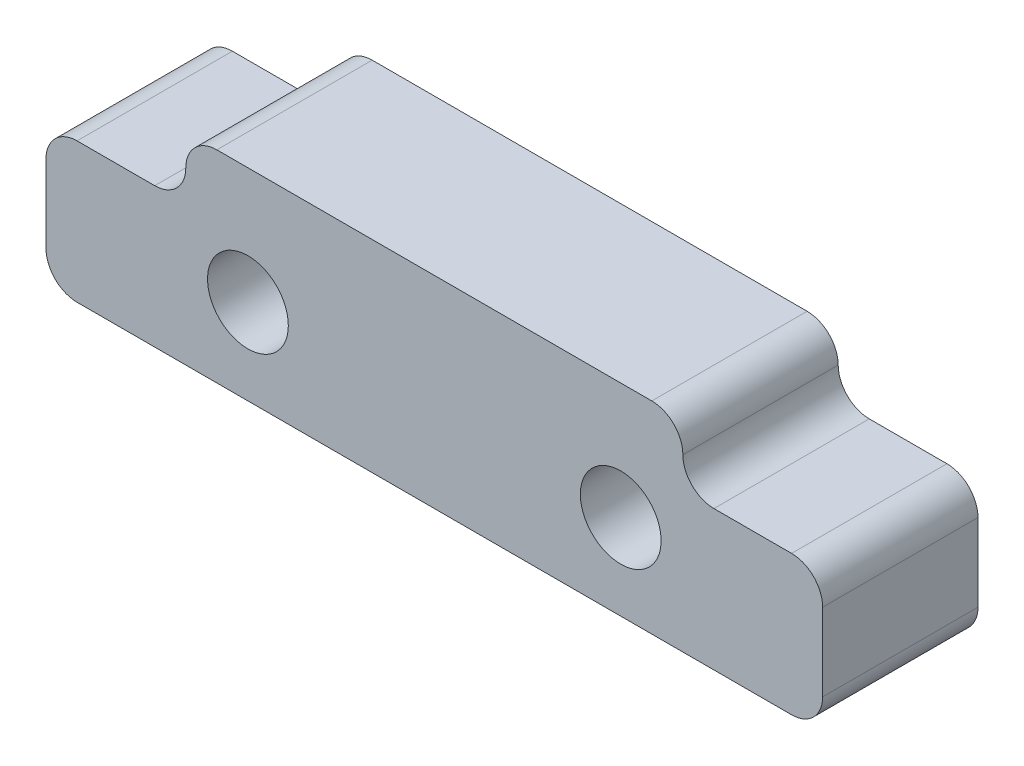
ISO-10303-21;
HEADER;
FILE_DESCRIPTION(('STEP AP214'),'2;1');
FILE_NAME('part.step','',(''),(''),'','','');
FILE_SCHEMA(('AUTOMOTIVE_DESIGN { 1 0 10303 214 1 1 1 1 }'));
ENDSEC;
DATA;
#1=APPLICATION_CONTEXT('core data for automotive mechanical design processes');
#2=APPLICATION_PROTOCOL_DEFINITION('international standard','automotive_design',2000,#1);
#3=PRODUCT_CONTEXT('',#1,'mechanical');
#4=PRODUCT('Part','Part','',(#3));
#5=PRODUCT_RELATED_PRODUCT_CATEGORY('part','',(#4));
#6=PRODUCT_DEFINITION_FORMATION('','',#4);
#7=PRODUCT_DEFINITION_CONTEXT('part definition',#1,'design');
#8=PRODUCT_DEFINITION('design','',#6,#7);
#9=PRODUCT_DEFINITION_SHAPE('','',#8);
#10=(LENGTH_UNIT() NAMED_UNIT(*) SI_UNIT(.MILLI.,.METRE.));
#11=(NAMED_UNIT(*) PLANE_ANGLE_UNIT() SI_UNIT($,.RADIAN.));
#12=(NAMED_UNIT(*) SI_UNIT($,.STERADIAN.) SOLID_ANGLE_UNIT());
#13=UNCERTAINTY_MEASURE_WITH_UNIT(LENGTH_MEASURE(1.E-05),#10,'distance_accuracy_value','');
#14=(GEOMETRIC_REPRESENTATION_CONTEXT(3) GLOBAL_UNCERTAINTY_ASSIGNED_CONTEXT((#13)) GLOBAL_UNIT_ASSIGNED_CONTEXT((#10,
#11,#12)) REPRESENTATION_CONTEXT('',''));
#15=CARTESIAN_POINT('',(0.,0.,0.));
#16=DIRECTION('',(0.,0.,1.));
#17=DIRECTION('',(1.,0.,0.));
#18=AXIS2_PLACEMENT_3D('',#15,#16,#17);
#19=CARTESIAN_POINT('',(0.,0.,5.));
#20=DIRECTION('',(0.,0.,-1.));
#21=DIRECTION('',(-1.,0.,0.));
#22=AXIS2_PLACEMENT_3D('',#19,#20,#21);
#23=PLANE('',#22);
#24=DIRECTION('',(1.,0.,0.));
#25=VECTOR('',#24,1.);
#26=CARTESIAN_POINT('',(12.5,-2.25,5.));
#27=LINE('',#26,#25);
#28=CARTESIAN_POINT('',(-11.5,-2.25,5.));
#29=VERTEX_POINT('',#28);
#30=CARTESIAN_POINT('',(11.5,-2.25,5.));
#31=VERTEX_POINT('',#30);
#32=EDGE_CURVE('E252',#29,#31,#27,.T.);
#33=ORIENTED_EDGE('',*,*,#32,.T.);
#34=CARTESIAN_POINT('',(11.5,-1.25,5.));
#35=DIRECTION('',(0.,0.,-1.));
#36=DIRECTION('',(-1.,0.,0.));
#37=AXIS2_PLACEMENT_3D('',#34,#35,#36);
#38=CIRCLE('',#37,1.);
#39=CARTESIAN_POINT('',(12.5,-1.25,5.));
#40=VERTEX_POINT('',#39);
#41=EDGE_CURVE('E198',#31,#40,#38,.F.);
#42=ORIENTED_EDGE('',*,*,#41,.T.);
#43=DIRECTION('',(0.,1.,0.));
#44=VECTOR('',#43,1.);
#45=CARTESIAN_POINT('',(12.5,-2.25,5.));
#46=LINE('',#45,#44);
#47=CARTESIAN_POINT('',(12.5,1.25,5.));
#48=VERTEX_POINT('',#47);
#49=EDGE_CURVE('E156',#40,#48,#46,.T.);
#50=ORIENTED_EDGE('',*,*,#49,.T.);
#51=CARTESIAN_POINT('',(11.5,1.25,5.));
#52=DIRECTION('',(0.,0.,-1.));
#53=DIRECTION('',(-1.,0.,0.));
#54=AXIS2_PLACEMENT_3D('',#51,#52,#53);
#55=CIRCLE('',#54,1.);
#56=CARTESIAN_POINT('',(11.5,2.25,5.));
#57=VERTEX_POINT('',#56);
#58=EDGE_CURVE('E196',#48,#57,#55,.F.);
#59=ORIENTED_EDGE('',*,*,#58,.T.);
#60=DIRECTION('',(-1.,0.,0.));
#61=VECTOR('',#60,1.);
#62=CARTESIAN_POINT('',(12.5,2.25,5.));
#63=LINE('',#62,#61);
#64=CARTESIAN_POINT('',(9.00000000000001,2.25,5.));
#65=VERTEX_POINT('',#64);
#66=EDGE_CURVE('E246',#57,#65,#63,.T.);
#67=ORIENTED_EDGE('',*,*,#66,.T.);
#68=CARTESIAN_POINT('',(9.00000000000001,3.25,5.));
#69=DIRECTION('',(0.,0.,-1.));
#70=DIRECTION('',(-1.,0.,0.));
#71=AXIS2_PLACEMENT_3D('',#68,#69,#70);
#72=CIRCLE('',#71,1.);
#73=CARTESIAN_POINT('',(8.,3.25,5.));
#74=VERTEX_POINT('',#73);
#75=EDGE_CURVE('E221',#65,#74,#72,.T.);
#76=ORIENTED_EDGE('',*,*,#75,.T.);
#77=CARTESIAN_POINT('',(7.,3.25,5.));
#78=DIRECTION('',(0.,0.,-1.));
#79=DIRECTION('',(-1.,0.,0.));
#80=AXIS2_PLACEMENT_3D('',#77,#78,#79);
#81=CIRCLE('',#80,1.);
#82=CARTESIAN_POINT('',(7.,4.25,5.));
#83=VERTEX_POINT('',#82);
#84=EDGE_CURVE('E189',#74,#83,#81,.F.);
#85=ORIENTED_EDGE('',*,*,#84,.T.);
#86=DIRECTION('',(-1.,0.,0.));
#87=VECTOR('',#86,1.);
#88=CARTESIAN_POINT('',(-8.,4.25,5.));
#89=LINE('',#88,#87);
#90=CARTESIAN_POINT('',(-7.,4.25,5.));
#91=VERTEX_POINT('',#90);
#92=EDGE_CURVE('E176',#83,#91,#89,.T.);
#93=ORIENTED_EDGE('',*,*,#92,.T.);
#94=CARTESIAN_POINT('',(-7.,3.25,5.));
#95=DIRECTION('',(0.,0.,-1.));
#96=DIRECTION('',(-1.,0.,0.));
#97=AXIS2_PLACEMENT_3D('',#94,#95,#96);
#98=CIRCLE('',#97,1.);
#99=CARTESIAN_POINT('',(-8.,3.25,5.));
#100=VERTEX_POINT('',#99);
#101=EDGE_CURVE('E50',#91,#100,#98,.F.);
#102=ORIENTED_EDGE('',*,*,#101,.T.);
#103=CARTESIAN_POINT('',(-9.,3.25,5.));
#104=DIRECTION('',(0.,0.,-1.));
#105=DIRECTION('',(-1.,0.,0.));
#106=AXIS2_PLACEMENT_3D('',#103,#104,#105);
#107=CIRCLE('',#106,1.);
#108=CARTESIAN_POINT('',(-9.,2.25,5.));
#109=VERTEX_POINT('',#108);
#110=EDGE_CURVE('E11',#100,#109,#107,.T.);
#111=ORIENTED_EDGE('',*,*,#110,.T.);
#112=DIRECTION('',(-1.,0.,0.));
#113=VECTOR('',#112,1.);
#114=CARTESIAN_POINT('',(-8.,2.25,5.));
#115=LINE('',#114,#113);
#116=CARTESIAN_POINT('',(-11.5,2.25,5.));
#117=VERTEX_POINT('',#116);
#118=EDGE_CURVE('E175',#109,#117,#115,.T.);
#119=ORIENTED_EDGE('',*,*,#118,.T.);
#120=CARTESIAN_POINT('',(-11.5,1.25,5.));
#121=DIRECTION('',(0.,0.,-1.));
#122=DIRECTION('',(-1.,0.,0.));
#123=AXIS2_PLACEMENT_3D('',#120,#121,#122);
#124=CIRCLE('',#123,1.);
#125=CARTESIAN_POINT('',(-12.5,1.25,5.));
#126=VERTEX_POINT('',#125);
#127=EDGE_CURVE('E192',#117,#126,#124,.F.);
#128=ORIENTED_EDGE('',*,*,#127,.T.);
#129=DIRECTION('',(0.,-1.,0.));
#130=VECTOR('',#129,1.);
#131=CARTESIAN_POINT('',(-12.5,-2.25,5.));
#132=LINE('',#131,#130);
#133=CARTESIAN_POINT('',(-12.5,-1.25,5.));
#134=VERTEX_POINT('',#133);
#135=EDGE_CURVE('E255',#126,#134,#132,.T.);
#136=ORIENTED_EDGE('',*,*,#135,.T.);
#137=CARTESIAN_POINT('',(-11.5,-1.25,5.));
#138=DIRECTION('',(0.,0.,-1.));
#139=DIRECTION('',(-1.,0.,0.));
#140=AXIS2_PLACEMENT_3D('',#137,#138,#139);
#141=CIRCLE('',#140,1.);
#142=EDGE_CURVE('E194',#134,#29,#141,.F.);
#143=ORIENTED_EDGE('',*,*,#142,.T.);
#144=EDGE_LOOP('',(#33,#42,#50,#59,#67,#76,#85,#93,#102,#111,#119,#128,#136,#143));
#145=FACE_BOUND('',#144,.T.);
#146=CARTESIAN_POINT('',(-6.,0.5,5.));
#147=DIRECTION('',(0.,0.,1.));
#148=DIRECTION('',(1.,0.,0.));
#149=AXIS2_PLACEMENT_3D('',#146,#147,#148);
#150=CIRCLE('',#149,1.3);
#151=CARTESIAN_POINT('',(-4.7,0.5,5.));
#152=VERTEX_POINT('',#151);
#153=EDGE_CURVE('E262',#152,#152,#150,.T.);
#154=ORIENTED_EDGE('',*,*,#153,.F.);
#155=EDGE_LOOP('',(#154));
#156=FACE_BOUND('',#155,.T.);
#157=CARTESIAN_POINT('',(6.,0.5,5.));
#158=DIRECTION('',(0.,0.,1.));
#159=DIRECTION('',(-1.,0.,0.));
#160=AXIS2_PLACEMENT_3D('',#157,#158,#159);
#161=CIRCLE('',#160,1.3);
#162=CARTESIAN_POINT('',(4.7,0.5,5.));
#163=VERTEX_POINT('',#162);
#164=EDGE_CURVE('E228',#163,#163,#161,.T.);
#165=ORIENTED_EDGE('',*,*,#164,.F.);
#166=EDGE_LOOP('',(#165));
#167=FACE_BOUND('',#166,.T.);
#168=ADVANCED_FACE('F34',(#145,#156,#167),#23,.F.);
#169=CARTESIAN_POINT('',(0.,0.,0.));
#170=DIRECTION('',(0.,0.,-1.));
#171=DIRECTION('',(-1.,0.,0.));
#172=AXIS2_PLACEMENT_3D('',#169,#170,#171);
#173=PLANE('',#172);
#174=CARTESIAN_POINT('',(-6.,0.5,0.));
#175=DIRECTION('',(0.,0.,1.));
#176=DIRECTION('',(1.,0.,0.));
#177=AXIS2_PLACEMENT_3D('',#174,#175,#176);
#178=CIRCLE('',#177,1.3);
#179=CARTESIAN_POINT('',(-4.7,0.5,0.));
#180=VERTEX_POINT('',#179);
#181=EDGE_CURVE('E443',#180,#180,#178,.T.);
#182=ORIENTED_EDGE('',*,*,#181,.T.);
#183=EDGE_LOOP('',(#182));
#184=FACE_BOUND('',#183,.T.);
#185=DIRECTION('',(0.,1.,0.));
#186=VECTOR('',#185,1.);
#187=CARTESIAN_POINT('',(12.5,-2.25,0.));
#188=LINE('',#187,#186);
#189=CARTESIAN_POINT('',(12.5,-1.25,0.));
#190=VERTEX_POINT('',#189);
#191=CARTESIAN_POINT('',(12.5,1.25,0.));
#192=VERTEX_POINT('',#191);
#193=EDGE_CURVE('E153',#190,#192,#188,.T.);
#194=ORIENTED_EDGE('',*,*,#193,.F.);
#195=CARTESIAN_POINT('',(11.5,-1.25,0.));
#196=DIRECTION('',(0.,0.,-1.));
#197=DIRECTION('',(-1.,0.,0.));
#198=AXIS2_PLACEMENT_3D('',#195,#196,#197);
#199=CIRCLE('',#198,1.);
#200=CARTESIAN_POINT('',(11.5,-2.25,0.));
#201=VERTEX_POINT('',#200);
#202=EDGE_CURVE('E136',#190,#201,#199,.T.);
#203=ORIENTED_EDGE('',*,*,#202,.T.);
#204=DIRECTION('',(1.,0.,0.));
#205=VECTOR('',#204,1.);
#206=CARTESIAN_POINT('',(12.5,-2.25,0.));
#207=LINE('',#206,#205);
#208=CARTESIAN_POINT('',(-11.5,-2.25,0.));
#209=VERTEX_POINT('',#208);
#210=EDGE_CURVE('E164',#209,#201,#207,.T.);
#211=ORIENTED_EDGE('',*,*,#210,.F.);
#212=CARTESIAN_POINT('',(-11.5,-1.25,0.));
#213=DIRECTION('',(0.,0.,-1.));
#214=DIRECTION('',(-1.,0.,0.));
#215=AXIS2_PLACEMENT_3D('',#212,#213,#214);
#216=CIRCLE('',#215,1.);
#217=CARTESIAN_POINT('',(-12.5,-1.25,0.));
#218=VERTEX_POINT('',#217);
#219=EDGE_CURVE('E183',#209,#218,#216,.T.);
#220=ORIENTED_EDGE('',*,*,#219,.T.);
#221=DIRECTION('',(0.,-1.,0.));
#222=VECTOR('',#221,1.);
#223=CARTESIAN_POINT('',(-12.5,-2.25,0.));
#224=LINE('',#223,#222);
#225=CARTESIAN_POINT('',(-12.5,1.25,0.));
#226=VERTEX_POINT('',#225);
#227=EDGE_CURVE('E169',#226,#218,#224,.T.);
#228=ORIENTED_EDGE('',*,*,#227,.F.);
#229=CARTESIAN_POINT('',(-11.5,1.25,0.));
#230=DIRECTION('',(0.,0.,-1.));
#231=DIRECTION('',(-1.,0.,0.));
#232=AXIS2_PLACEMENT_3D('',#229,#230,#231);
#233=CIRCLE('',#232,1.);
#234=CARTESIAN_POINT('',(-11.5,2.25,0.));
#235=VERTEX_POINT('',#234);
#236=EDGE_CURVE('E181',#226,#235,#233,.T.);
#237=ORIENTED_EDGE('',*,*,#236,.T.);
#238=DIRECTION('',(-1.,0.,0.));
#239=VECTOR('',#238,1.);
#240=CARTESIAN_POINT('',(-8.,2.25,0.));
#241=LINE('',#240,#239);
#242=CARTESIAN_POINT('',(-9.,2.25,0.));
#243=VERTEX_POINT('',#242);
#244=EDGE_CURVE('E260',#243,#235,#241,.T.);
#245=ORIENTED_EDGE('',*,*,#244,.F.);
#246=CARTESIAN_POINT('',(-9.,3.25,0.));
#247=DIRECTION('',(0.,0.,-1.));
#248=DIRECTION('',(-1.,0.,0.));
#249=AXIS2_PLACEMENT_3D('',#246,#247,#248);
#250=CIRCLE('',#249,1.);
#251=CARTESIAN_POINT('',(-8.,3.25,0.));
#252=VERTEX_POINT('',#251);
#253=EDGE_CURVE('E43',#243,#252,#250,.F.);
#254=ORIENTED_EDGE('',*,*,#253,.T.);
#255=CARTESIAN_POINT('',(-7.,3.25,0.));
#256=DIRECTION('',(0.,0.,-1.));
#257=DIRECTION('',(-1.,0.,0.));
#258=AXIS2_PLACEMENT_3D('',#255,#256,#257);
#259=CIRCLE('',#258,1.);
#260=CARTESIAN_POINT('',(-7.,4.25,0.));
#261=VERTEX_POINT('',#260);
#262=EDGE_CURVE('E179',#252,#261,#259,.T.);
#263=ORIENTED_EDGE('',*,*,#262,.T.);
#264=DIRECTION('',(-1.,0.,0.));
#265=VECTOR('',#264,1.);
#266=CARTESIAN_POINT('',(-8.,4.25,0.));
#267=LINE('',#266,#265);
#268=CARTESIAN_POINT('',(7.,4.25,0.));
#269=VERTEX_POINT('',#268);
#270=EDGE_CURVE('E167',#269,#261,#267,.T.);
#271=ORIENTED_EDGE('',*,*,#270,.F.);
#272=CARTESIAN_POINT('',(7.,3.25,0.));
#273=DIRECTION('',(0.,0.,-1.));
#274=DIRECTION('',(-1.,0.,0.));
#275=AXIS2_PLACEMENT_3D('',#272,#273,#274);
#276=CIRCLE('',#275,1.);
#277=CARTESIAN_POINT('',(8.,3.25,0.));
#278=VERTEX_POINT('',#277);
#279=EDGE_CURVE('E157',#269,#278,#276,.T.);
#280=ORIENTED_EDGE('',*,*,#279,.T.);
#281=CARTESIAN_POINT('',(9.00000000000001,3.25,0.));
#282=DIRECTION('',(0.,0.,-1.));
#283=DIRECTION('',(-1.,0.,0.));
#284=AXIS2_PLACEMENT_3D('',#281,#282,#283);
#285=CIRCLE('',#284,1.);
#286=CARTESIAN_POINT('',(9.00000000000001,2.25,0.));
#287=VERTEX_POINT('',#286);
#288=EDGE_CURVE('E219',#278,#287,#285,.F.);
#289=ORIENTED_EDGE('',*,*,#288,.T.);
#290=DIRECTION('',(-1.,0.,0.));
#291=VECTOR('',#290,1.);
#292=CARTESIAN_POINT('',(12.5,2.25,0.));
#293=LINE('',#292,#291);
#294=CARTESIAN_POINT('',(11.5,2.25,0.));
#295=VERTEX_POINT('',#294);
#296=EDGE_CURVE('E163',#295,#287,#293,.T.);
#297=ORIENTED_EDGE('',*,*,#296,.F.);
#298=CARTESIAN_POINT('',(11.5,1.25,0.));
#299=DIRECTION('',(0.,0.,-1.));
#300=DIRECTION('',(-1.,0.,0.));
#301=AXIS2_PLACEMENT_3D('',#298,#299,#300);
#302=CIRCLE('',#301,1.);
#303=EDGE_CURVE('E147',#295,#192,#302,.T.);
#304=ORIENTED_EDGE('',*,*,#303,.T.);
#305=EDGE_LOOP('',(#194,#203,#211,#220,#228,#237,#245,#254,#263,#271,#280,#289,#297,#304));
#306=FACE_BOUND('',#305,.T.);
#307=CARTESIAN_POINT('',(6.,0.5,0.));
#308=DIRECTION('',(0.,0.,1.));
#309=DIRECTION('',(-1.,0.,0.));
#310=AXIS2_PLACEMENT_3D('',#307,#308,#309);
#311=CIRCLE('',#310,1.3);
#312=CARTESIAN_POINT('',(4.7,0.5,0.));
#313=VERTEX_POINT('',#312);
#314=EDGE_CURVE('E224',#313,#313,#311,.T.);
#315=ORIENTED_EDGE('',*,*,#314,.T.);
#316=EDGE_LOOP('',(#315));
#317=FACE_BOUND('',#316,.T.);
#318=ADVANCED_FACE('F160',(#184,#306,#317),#173,.T.);
#319=CARTESIAN_POINT('',(-8.,2.25,5.));
#320=DIRECTION('',(0.,-1.,0.));
#321=DIRECTION('',(1.,0.,0.));
#322=AXIS2_PLACEMENT_3D('',#319,#320,#321);
#323=PLANE('',#322);
#324=ORIENTED_EDGE('',*,*,#244,.T.);
#325=DIRECTION('',(0.,0.,-1.));
#326=VECTOR('',#325,1.);
#327=CARTESIAN_POINT('',(-11.5,2.25,5.));
#328=LINE('',#327,#326);
#329=EDGE_CURVE('E212',#235,#117,#328,.F.);
#330=ORIENTED_EDGE('',*,*,#329,.T.);
#331=ORIENTED_EDGE('',*,*,#118,.F.);
#332=DIRECTION('',(0.,0.,-1.));
#333=VECTOR('',#332,1.);
#334=CARTESIAN_POINT('',(-9.,2.25,0.));
#335=LINE('',#334,#333);
#336=EDGE_CURVE('E210',#109,#243,#335,.T.);
#337=ORIENTED_EDGE('',*,*,#336,.T.);
#338=EDGE_LOOP('',(#324,#330,#331,#337));
#339=FACE_BOUND('',#338,.T.);
#340=ADVANCED_FACE('F285',(#339),#323,.F.);
#341=CARTESIAN_POINT('',(-12.5,-2.25,5.));
#342=DIRECTION('',(1.,0.,0.));
#343=DIRECTION('',(0.,0.,-1.));
#344=AXIS2_PLACEMENT_3D('',#341,#342,#343);
#345=PLANE('',#344);
#346=ORIENTED_EDGE('',*,*,#227,.T.);
#347=DIRECTION('',(0.,0.,-1.));
#348=VECTOR('',#347,1.);
#349=CARTESIAN_POINT('',(-12.5,-1.25,5.));
#350=LINE('',#349,#348);
#351=EDGE_CURVE('E208',#218,#134,#350,.F.);
#352=ORIENTED_EDGE('',*,*,#351,.T.);
#353=ORIENTED_EDGE('',*,*,#135,.F.);
#354=DIRECTION('',(0.,0.,-1.));
#355=VECTOR('',#354,1.);
#356=CARTESIAN_POINT('',(-12.5,1.25,5.));
#357=LINE('',#356,#355);
#358=EDGE_CURVE('E205',#126,#226,#357,.T.);
#359=ORIENTED_EDGE('',*,*,#358,.T.);
#360=EDGE_LOOP('',(#346,#352,#353,#359));
#361=FACE_BOUND('',#360,.T.);
#362=ADVANCED_FACE('F267',(#361),#345,.F.);
#363=CARTESIAN_POINT('',(12.5,-2.25,5.));
#364=DIRECTION('',(0.,1.,0.));
#365=DIRECTION('',(-1.,0.,0.));
#366=AXIS2_PLACEMENT_3D('',#363,#364,#365);
#367=PLANE('',#366);
#368=ORIENTED_EDGE('',*,*,#210,.T.);
#369=DIRECTION('',(0.,0.,-1.));
#370=VECTOR('',#369,1.);
#371=CARTESIAN_POINT('',(11.5,-2.25,5.));
#372=LINE('',#371,#370);
#373=EDGE_CURVE('E141',#201,#31,#372,.F.);
#374=ORIENTED_EDGE('',*,*,#373,.T.);
#375=ORIENTED_EDGE('',*,*,#32,.F.);
#376=DIRECTION('',(0.,0.,-1.));
#377=VECTOR('',#376,1.);
#378=CARTESIAN_POINT('',(-11.5,-2.25,5.));
#379=LINE('',#378,#377);
#380=EDGE_CURVE('E146',#29,#209,#379,.T.);
#381=ORIENTED_EDGE('',*,*,#380,.T.);
#382=EDGE_LOOP('',(#368,#374,#375,#381));
#383=FACE_BOUND('',#382,.T.);
#384=ADVANCED_FACE('F277',(#383),#367,.F.);
#385=CARTESIAN_POINT('',(12.5,-2.25,5.));
#386=DIRECTION('',(-1.,0.,0.));
#387=DIRECTION('',(0.,0.,1.));
#388=AXIS2_PLACEMENT_3D('',#385,#386,#387);
#389=PLANE('',#388);
#390=ORIENTED_EDGE('',*,*,#49,.F.);
#391=DIRECTION('',(0.,0.,-1.));
#392=VECTOR('',#391,1.);
#393=CARTESIAN_POINT('',(12.5,-1.25,5.));
#394=LINE('',#393,#392);
#395=EDGE_CURVE('E140',#40,#190,#394,.T.);
#396=ORIENTED_EDGE('',*,*,#395,.T.);
#397=ORIENTED_EDGE('',*,*,#193,.T.);
#398=DIRECTION('',(0.,0.,-1.));
#399=VECTOR('',#398,1.);
#400=CARTESIAN_POINT('',(12.5,1.25,5.));
#401=LINE('',#400,#399);
#402=EDGE_CURVE('E158',#192,#48,#401,.F.);
#403=ORIENTED_EDGE('',*,*,#402,.T.);
#404=EDGE_LOOP('',(#390,#396,#397,#403));
#405=FACE_BOUND('',#404,.T.);
#406=ADVANCED_FACE('F152',(#405),#389,.F.);
#407=CARTESIAN_POINT('',(12.5,2.25,5.));
#408=DIRECTION('',(0.,-1.,0.));
#409=DIRECTION('',(1.,0.,0.));
#410=AXIS2_PLACEMENT_3D('',#407,#408,#409);
#411=PLANE('',#410);
#412=ORIENTED_EDGE('',*,*,#66,.F.);
#413=DIRECTION('',(0.,0.,-1.));
#414=VECTOR('',#413,1.);
#415=CARTESIAN_POINT('',(11.5,2.25,5.));
#416=LINE('',#415,#414);
#417=EDGE_CURVE('E202',#57,#295,#416,.T.);
#418=ORIENTED_EDGE('',*,*,#417,.T.);
#419=ORIENTED_EDGE('',*,*,#296,.T.);
#420=DIRECTION('',(0.,0.,-1.));
#421=VECTOR('',#420,1.);
#422=CARTESIAN_POINT('',(9.00000000000001,2.25,5.));
#423=LINE('',#422,#421);
#424=EDGE_CURVE('E200',#287,#65,#423,.F.);
#425=ORIENTED_EDGE('',*,*,#424,.T.);
#426=EDGE_LOOP('',(#412,#418,#419,#425));
#427=FACE_BOUND('',#426,.T.);
#428=ADVANCED_FACE('F243',(#427),#411,.F.);
#429=CARTESIAN_POINT('',(-8.,4.25,5.));
#430=DIRECTION('',(0.,-1.,0.));
#431=DIRECTION('',(0.,0.,-1.));
#432=AXIS2_PLACEMENT_3D('',#429,#430,#431);
#433=PLANE('',#432);
#434=ORIENTED_EDGE('',*,*,#270,.T.);
#435=DIRECTION('',(0.,0.,-1.));
#436=VECTOR('',#435,1.);
#437=CARTESIAN_POINT('',(-7.,4.25,5.));
#438=LINE('',#437,#436);
#439=EDGE_CURVE('E217',#261,#91,#438,.F.);
#440=ORIENTED_EDGE('',*,*,#439,.T.);
#441=ORIENTED_EDGE('',*,*,#92,.F.);
#442=DIRECTION('',(0.,0.,-1.));
#443=VECTOR('',#442,1.);
#444=CARTESIAN_POINT('',(7.,4.25,5.));
#445=LINE('',#444,#443);
#446=EDGE_CURVE('E214',#83,#269,#445,.T.);
#447=ORIENTED_EDGE('',*,*,#446,.T.);
#448=EDGE_LOOP('',(#434,#440,#441,#447));
#449=FACE_BOUND('',#448,.T.);
#450=ADVANCED_FACE('F298',(#449),#433,.F.);
#451=CARTESIAN_POINT('',(-6.,0.5,5.));
#452=DIRECTION('',(0.,0.,-1.));
#453=DIRECTION('',(-1.,0.,0.));
#454=AXIS2_PLACEMENT_3D('',#451,#452,#453);
#455=CYLINDRICAL_SURFACE('',#454,1.3);
#456=ORIENTED_EDGE('',*,*,#153,.T.);
#457=EDGE_LOOP('',(#456));
#458=FACE_BOUND('',#457,.T.);
#459=ORIENTED_EDGE('',*,*,#181,.F.);
#460=EDGE_LOOP('',(#459));
#461=FACE_BOUND('',#460,.T.);
#462=ADVANCED_FACE('F295',(#458,#461),#455,.F.);
#463=CARTESIAN_POINT('',(6.,0.5,5.));
#464=DIRECTION('',(0.,0.,-1.));
#465=DIRECTION('',(-1.,0.,0.));
#466=AXIS2_PLACEMENT_3D('',#463,#464,#465);
#467=CYLINDRICAL_SURFACE('',#466,1.3);
#468=ORIENTED_EDGE('',*,*,#164,.T.);
#469=EDGE_LOOP('',(#468));
#470=FACE_BOUND('',#469,.T.);
#471=ORIENTED_EDGE('',*,*,#314,.F.);
#472=EDGE_LOOP('',(#471));
#473=FACE_BOUND('',#472,.T.);
#474=ADVANCED_FACE('F318',(#470,#473),#467,.F.);
#475=CARTESIAN_POINT('',(11.5,-1.25,5.));
#476=DIRECTION('',(0.,0.,-1.));
#477=DIRECTION('',(-1.,0.,0.));
#478=AXIS2_PLACEMENT_3D('',#475,#476,#477);
#479=CYLINDRICAL_SURFACE('',#478,1.);
#480=ORIENTED_EDGE('',*,*,#41,.F.);
#481=ORIENTED_EDGE('',*,*,#373,.F.);
#482=ORIENTED_EDGE('',*,*,#202,.F.);
#483=ORIENTED_EDGE('',*,*,#395,.F.);
#484=EDGE_LOOP('',(#480,#481,#482,#483));
#485=FACE_BOUND('',#484,.T.);
#486=ADVANCED_FACE('F139',(#485),#479,.T.);
#487=CARTESIAN_POINT('',(11.5,1.25,5.));
#488=DIRECTION('',(0.,0.,-1.));
#489=DIRECTION('',(-1.,0.,0.));
#490=AXIS2_PLACEMENT_3D('',#487,#488,#489);
#491=CYLINDRICAL_SURFACE('',#490,1.);
#492=ORIENTED_EDGE('',*,*,#58,.F.);
#493=ORIENTED_EDGE('',*,*,#402,.F.);
#494=ORIENTED_EDGE('',*,*,#303,.F.);
#495=ORIENTED_EDGE('',*,*,#417,.F.);
#496=EDGE_LOOP('',(#492,#493,#494,#495));
#497=FACE_BOUND('',#496,.T.);
#498=ADVANCED_FACE('F249',(#497),#491,.T.);
#499=CARTESIAN_POINT('',(-11.5,-1.25,5.));
#500=DIRECTION('',(0.,0.,-1.));
#501=DIRECTION('',(-1.,0.,0.));
#502=AXIS2_PLACEMENT_3D('',#499,#500,#501);
#503=CYLINDRICAL_SURFACE('',#502,1.);
#504=ORIENTED_EDGE('',*,*,#142,.F.);
#505=ORIENTED_EDGE('',*,*,#351,.F.);
#506=ORIENTED_EDGE('',*,*,#219,.F.);
#507=ORIENTED_EDGE('',*,*,#380,.F.);
#508=EDGE_LOOP('',(#504,#505,#506,#507));
#509=FACE_BOUND('',#508,.T.);
#510=ADVANCED_FACE('F273',(#509),#503,.T.);
#511=CARTESIAN_POINT('',(-11.5,1.25,5.));
#512=DIRECTION('',(0.,0.,-1.));
#513=DIRECTION('',(-1.,0.,0.));
#514=AXIS2_PLACEMENT_3D('',#511,#512,#513);
#515=CYLINDRICAL_SURFACE('',#514,1.);
#516=ORIENTED_EDGE('',*,*,#127,.F.);
#517=ORIENTED_EDGE('',*,*,#329,.F.);
#518=ORIENTED_EDGE('',*,*,#236,.F.);
#519=ORIENTED_EDGE('',*,*,#358,.F.);
#520=EDGE_LOOP('',(#516,#517,#518,#519));
#521=FACE_BOUND('',#520,.T.);
#522=ADVANCED_FACE('F342',(#521),#515,.T.);
#523=CARTESIAN_POINT('',(-9.,3.25,5.));
#524=DIRECTION('',(0.,0.,1.));
#525=DIRECTION('',(1.,0.,0.));
#526=AXIS2_PLACEMENT_3D('',#523,#524,#525);
#527=CYLINDRICAL_SURFACE('',#526,1.);
#528=ORIENTED_EDGE('',*,*,#336,.F.);
#529=ORIENTED_EDGE('',*,*,#110,.F.);
#530=DIRECTION('',(0.,0.,-1.));
#531=VECTOR('',#530,1.);
#532=CARTESIAN_POINT('',(-8.,3.25,5.));
#533=LINE('',#532,#531);
#534=EDGE_CURVE('E223',#252,#100,#533,.F.);
#535=ORIENTED_EDGE('',*,*,#534,.F.);
#536=ORIENTED_EDGE('',*,*,#253,.F.);
#537=EDGE_LOOP('',(#528,#529,#535,#536));
#538=FACE_BOUND('',#537,.T.);
#539=ADVANCED_FACE('F349',(#538),#527,.F.);
#540=CARTESIAN_POINT('',(-7.,3.25,5.));
#541=DIRECTION('',(0.,0.,-1.));
#542=DIRECTION('',(-1.,0.,0.));
#543=AXIS2_PLACEMENT_3D('',#540,#541,#542);
#544=CYLINDRICAL_SURFACE('',#543,1.);
#545=ORIENTED_EDGE('',*,*,#101,.F.);
#546=ORIENTED_EDGE('',*,*,#439,.F.);
#547=ORIENTED_EDGE('',*,*,#262,.F.);
#548=ORIENTED_EDGE('',*,*,#534,.T.);
#549=EDGE_LOOP('',(#545,#546,#547,#548));
#550=FACE_BOUND('',#549,.T.);
#551=ADVANCED_FACE('F357',(#550),#544,.T.);
#552=CARTESIAN_POINT('',(9.00000000000001,3.25,5.));
#553=DIRECTION('',(0.,0.,1.));
#554=DIRECTION('',(1.,0.,0.));
#555=AXIS2_PLACEMENT_3D('',#552,#553,#554);
#556=CYLINDRICAL_SURFACE('',#555,1.);
#557=DIRECTION('',(0.,0.,-1.));
#558=VECTOR('',#557,1.);
#559=CARTESIAN_POINT('',(8.,3.25,0.));
#560=LINE('',#559,#558);
#561=EDGE_CURVE('E38',#74,#278,#560,.T.);
#562=ORIENTED_EDGE('',*,*,#561,.F.);
#563=ORIENTED_EDGE('',*,*,#75,.F.);
#564=ORIENTED_EDGE('',*,*,#424,.F.);
#565=ORIENTED_EDGE('',*,*,#288,.F.);
#566=EDGE_LOOP('',(#562,#563,#564,#565));
#567=FACE_BOUND('',#566,.T.);
#568=ADVANCED_FACE('F36',(#567),#556,.F.);
#569=CARTESIAN_POINT('',(7.,3.25,5.));
#570=DIRECTION('',(0.,0.,-1.));
#571=DIRECTION('',(-1.,0.,0.));
#572=AXIS2_PLACEMENT_3D('',#569,#570,#571);
#573=CYLINDRICAL_SURFACE('',#572,1.);
#574=ORIENTED_EDGE('',*,*,#84,.F.);
#575=ORIENTED_EDGE('',*,*,#561,.T.);
#576=ORIENTED_EDGE('',*,*,#279,.F.);
#577=ORIENTED_EDGE('',*,*,#446,.F.);
#578=EDGE_LOOP('',(#574,#575,#576,#577));
#579=FACE_BOUND('',#578,.T.);
#580=ADVANCED_FACE('F234',(#579),#573,.T.);
#581=CLOSED_SHELL('',(#168,#318,#340,#362,#384,#406,#428,#450,#462,#474,#486,#498,#510,#522,
#539,#551,#568,#580));
#582=MANIFOLD_SOLID_BREP('B2',#581);
#583=ADVANCED_BREP_SHAPE_REPRESENTATION('',(#18,#582),#14);
#584=SHAPE_DEFINITION_REPRESENTATION(#9,#583);
ENDSEC;
END-ISO-10303-21;
